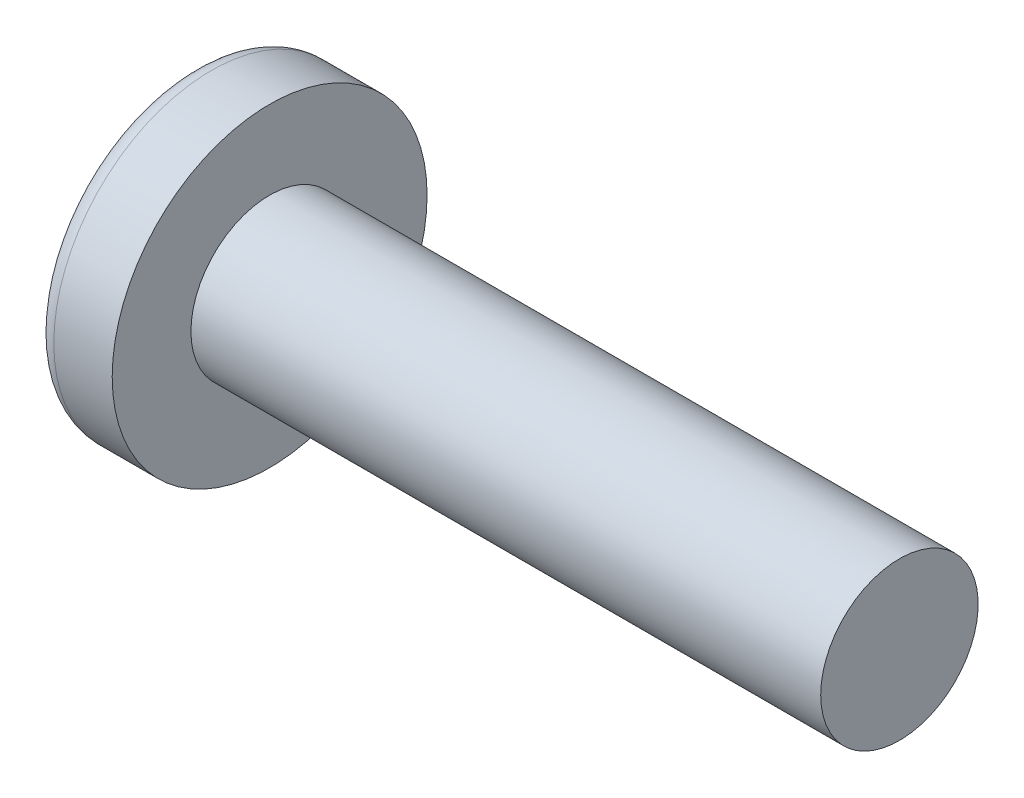
ISO-10303-21;
HEADER;
FILE_DESCRIPTION(('STEP AP214'),'2;1');
FILE_NAME('part.step','',(''),(''),'','','');
FILE_SCHEMA(('AUTOMOTIVE_DESIGN { 1 0 10303 214 1 1 1 1 }'));
ENDSEC;
DATA;
#1=APPLICATION_CONTEXT('core data for automotive mechanical design processes');
#2=APPLICATION_PROTOCOL_DEFINITION('international standard','automotive_design',2000,#1);
#3=PRODUCT_CONTEXT('',#1,'mechanical');
#4=PRODUCT('Part','Part','',(#3));
#5=PRODUCT_RELATED_PRODUCT_CATEGORY('part','',(#4));
#6=PRODUCT_DEFINITION_FORMATION('','',#4);
#7=PRODUCT_DEFINITION_CONTEXT('part definition',#1,'design');
#8=PRODUCT_DEFINITION('design','',#6,#7);
#9=PRODUCT_DEFINITION_SHAPE('','',#8);
#10=(LENGTH_UNIT() NAMED_UNIT(*) SI_UNIT(.MILLI.,.METRE.));
#11=(NAMED_UNIT(*) PLANE_ANGLE_UNIT() SI_UNIT($,.RADIAN.));
#12=(NAMED_UNIT(*) SI_UNIT($,.STERADIAN.) SOLID_ANGLE_UNIT());
#13=UNCERTAINTY_MEASURE_WITH_UNIT(LENGTH_MEASURE(1.E-05),#10,'distance_accuracy_value','');
#14=(GEOMETRIC_REPRESENTATION_CONTEXT(3) GLOBAL_UNCERTAINTY_ASSIGNED_CONTEXT((#13)) GLOBAL_UNIT_ASSIGNED_CONTEXT((#10,
#11,#12)) REPRESENTATION_CONTEXT('',''));
#15=CARTESIAN_POINT('',(0.,0.,0.));
#16=DIRECTION('',(0.,0.,1.));
#17=DIRECTION('',(1.,0.,0.));
#18=AXIS2_PLACEMENT_3D('',#15,#16,#17);
#19=CARTESIAN_POINT('',(6.5,0.,0.));
#20=DIRECTION('',(-1.,0.,0.));
#21=DIRECTION('',(0.,1.,0.));
#22=AXIS2_PLACEMENT_3D('',#19,#20,#21);
#23=SPHERICAL_SURFACE('',#22,6.5);
#24=CARTESIAN_POINT('',(1.22696010591455,0.,0.));
#25=DIRECTION('',(-1.,0.,0.));
#26=DIRECTION('',(0.,0.,1.));
#27=AXIS2_PLACEMENT_3D('',#24,#25,#26);
#28=CIRCLE('',#27,3.80066445182724);
#29=CARTESIAN_POINT('',(1.22696010591455,0.,3.80066445182724));
#30=VERTEX_POINT('',#29);
#31=EDGE_CURVE('E153',#30,#30,#28,.T.);
#32=ORIENTED_EDGE('',*,*,#31,.T.);
#33=EDGE_LOOP('',(#32));
#34=FACE_BOUND('',#33,.T.);
#35=CARTESIAN_POINT('',(6.48571960757402,-0.15048155459631,0.));
#36=DIRECTION('',(-0.0944735162161081,-0.995527375180494,0.));
#37=DIRECTION('',(0.995527375180494,-0.0944735162161081,0.));
#38=AXIS2_PLACEMENT_3D('',#35,#36,#37);
#39=CIRCLE('',#38,6.49824217555167);
#40=CARTESIAN_POINT('',(0.314004666074212,0.4352015980154,1.94783502836694));
#41=VERTEX_POINT('',#40);
#42=CARTESIAN_POINT('',(0.0329034112486444,0.461877533422321,0.461877533422322));
#43=VERTEX_POINT('',#42);
#44=EDGE_CURVE('E184',#41,#43,#39,.T.);
#45=ORIENTED_EDGE('',*,*,#44,.F.);
#46=CARTESIAN_POINT('',(5.02565375064329,0.,-1.83590765485334));
#47=DIRECTION('',(0.626149356629992,0.,0.779703137861998));
#48=DIRECTION('',(0.779703137861998,0.,-0.626149356629992));
#49=AXIS2_PLACEMENT_3D('',#46,#47,#48);
#50=CIRCLE('',#49,6.05852673674539);
#51=CARTESIAN_POINT('',(0.314004666074212,-0.435201598015413,1.94783502836693));
#52=VERTEX_POINT('',#51);
#53=EDGE_CURVE('E149',#41,#52,#50,.T.);
#54=ORIENTED_EDGE('',*,*,#53,.T.);
#55=CARTESIAN_POINT('',(6.48571960757402,0.15048155459631,0.));
#56=DIRECTION('',(-0.094473516216108,0.995527375180494,0.));
#57=DIRECTION('',(-0.995527375180494,-0.094473516216108,0.));
#58=AXIS2_PLACEMENT_3D('',#55,#56,#57);
#59=CIRCLE('',#58,6.49824217555167);
#60=CARTESIAN_POINT('',(0.0329034112486444,-0.461877533422324,0.461877533422322));
#61=VERTEX_POINT('',#60);
#62=EDGE_CURVE('E105',#61,#52,#59,.T.);
#63=ORIENTED_EDGE('',*,*,#62,.F.);
#64=CARTESIAN_POINT('',(6.48571960757402,0.,-0.15048155459631));
#65=DIRECTION('',(-0.094473516216108,0.,-0.995527375180494));
#66=DIRECTION('',(-0.995527375180494,0.,0.094473516216108));
#67=AXIS2_PLACEMENT_3D('',#64,#65,#66);
#68=CIRCLE('',#67,6.49824217555167);
#69=CARTESIAN_POINT('',(0.314004666074212,-1.94783502836693,0.435201598015406));
#70=VERTEX_POINT('',#69);
#71=EDGE_CURVE('E130',#70,#61,#68,.T.);
#72=ORIENTED_EDGE('',*,*,#71,.F.);
#73=CARTESIAN_POINT('',(5.02565375064329,1.83590765485334,0.));
#74=DIRECTION('',(0.626149356629992,-0.779703137861998,0.));
#75=DIRECTION('',(0.779703137861998,0.626149356629992,0.));
#76=AXIS2_PLACEMENT_3D('',#73,#74,#75);
#77=CIRCLE('',#76,6.05852673674539);
#78=CARTESIAN_POINT('',(0.314004666074212,-1.94783502836693,-0.435201598015406));
#79=VERTEX_POINT('',#78);
#80=EDGE_CURVE('E138',#70,#79,#77,.T.);
#81=ORIENTED_EDGE('',*,*,#80,.T.);
#82=CARTESIAN_POINT('',(6.48571960757402,0.,0.15048155459631));
#83=DIRECTION('',(-0.0944735162161081,0.,0.995527375180494));
#84=DIRECTION('',(0.995527375180494,0.,0.0944735162161081));
#85=AXIS2_PLACEMENT_3D('',#82,#83,#84);
#86=CIRCLE('',#85,6.49824217555167);
#87=CARTESIAN_POINT('',(0.0329034112486444,-0.461877533422321,-0.461877533422323));
#88=VERTEX_POINT('',#87);
#89=EDGE_CURVE('E48',#88,#79,#86,.T.);
#90=ORIENTED_EDGE('',*,*,#89,.F.);
#91=CARTESIAN_POINT('',(0.314004666074212,-0.435201598015399,-1.94783502836693));
#92=VERTEX_POINT('',#91);
#93=EDGE_CURVE('E191',#92,#88,#59,.T.);
#94=ORIENTED_EDGE('',*,*,#93,.F.);
#95=CARTESIAN_POINT('',(5.02565375064329,0.,1.83590765485334));
#96=DIRECTION('',(0.626149356629992,0.,-0.779703137861998));
#97=DIRECTION('',(-0.779703137861998,0.,-0.626149356629992));
#98=AXIS2_PLACEMENT_3D('',#95,#96,#97);
#99=CIRCLE('',#98,6.05852673674539);
#100=CARTESIAN_POINT('',(0.314004666074213,0.435201598015413,-1.94783502836693));
#101=VERTEX_POINT('',#100);
#102=EDGE_CURVE('E131',#92,#101,#99,.T.);
#103=ORIENTED_EDGE('',*,*,#102,.T.);
#104=CARTESIAN_POINT('',(0.0329034112486444,0.461877533422324,-0.461877533422323));
#105=VERTEX_POINT('',#104);
#106=EDGE_CURVE('E179',#105,#101,#39,.T.);
#107=ORIENTED_EDGE('',*,*,#106,.F.);
#108=CARTESIAN_POINT('',(0.314004666074214,1.94783502836693,-0.435201598015406));
#109=VERTEX_POINT('',#108);
#110=EDGE_CURVE('E41',#109,#105,#86,.T.);
#111=ORIENTED_EDGE('',*,*,#110,.F.);
#112=CARTESIAN_POINT('',(5.02565375064329,-1.83590765485334,0.));
#113=DIRECTION('',(0.626149356629992,0.779703137861998,0.));
#114=DIRECTION('',(-0.779703137861998,0.626149356629992,0.));
#115=AXIS2_PLACEMENT_3D('',#112,#113,#114);
#116=CIRCLE('',#115,6.05852673674539);
#117=CARTESIAN_POINT('',(0.314004666074214,1.94783502836693,0.435201598015406));
#118=VERTEX_POINT('',#117);
#119=EDGE_CURVE('E11',#109,#118,#116,.T.);
#120=ORIENTED_EDGE('',*,*,#119,.T.);
#121=EDGE_CURVE('E167',#43,#118,#68,.T.);
#122=ORIENTED_EDGE('',*,*,#121,.F.);
#123=EDGE_LOOP('',(#45,#54,#63,#72,#81,#90,#94,#103,#107,#111,#120,#122));
#124=FACE_BOUND('',#123,.T.);
#125=ADVANCED_FACE('F33',(#34,#124),#23,.T.);
#126=CARTESIAN_POINT('',(2.73951715374841,0.,-0.20502541296061));
#127=DIRECTION('',(-0.0944735162161081,0.,0.995527375180494));
#128=DIRECTION('',(0.995527375180494,0.,0.0944735162161081));
#129=AXIS2_PLACEMENT_3D('',#126,#127,#128);
#130=PLANE('',#129);
#131=ORIENTED_EDGE('',*,*,#110,.T.);
#132=DIRECTION('',(0.991114231601325,-0.0940547178968607,0.0940547178968604));
#133=VECTOR('',#132,1.);
#134=CARTESIAN_POINT('',(2.75862941145706,0.203211698708667,-0.203211698708667));
#135=LINE('',#134,#133);
#136=CARTESIAN_POINT('',(2.45,0.232500000000001,-0.232499999999999));
#137=VERTEX_POINT('',#136);
#138=EDGE_CURVE('E173',#105,#137,#135,.T.);
#139=ORIENTED_EDGE('',*,*,#138,.T.);
#140=DIRECTION('',(0.777577482844895,-0.624442325509115,0.0737905162291584));
#141=VECTOR('',#140,1.);
#142=CARTESIAN_POINT('',(0.,2.2,-0.465));
#143=LINE('',#142,#141);
#144=EDGE_CURVE('E154',#109,#137,#143,.T.);
#145=ORIENTED_EDGE('',*,*,#144,.F.);
#146=EDGE_LOOP('',(#131,#139,#145));
#147=FACE_BOUND('',#146,.T.);
#148=ADVANCED_FACE('F172',(#147),#130,.T.);
#149=DIRECTION('',(0.777577482844895,0.624442325509115,0.0737905162291584));
#150=VECTOR('',#149,1.);
#151=CARTESIAN_POINT('',(0.,-2.2,-0.465));
#152=LINE('',#151,#150);
#153=CARTESIAN_POINT('',(2.45,-0.2325,-0.2325));
#154=VERTEX_POINT('',#153);
#155=EDGE_CURVE('E139',#79,#154,#152,.T.);
#156=ORIENTED_EDGE('',*,*,#155,.T.);
#157=DIRECTION('',(-0.991114231601325,-0.0940547178968599,-0.0940547178968604));
#158=VECTOR('',#157,1.);
#159=CARTESIAN_POINT('',(2.75862941145706,-0.203211698708666,-0.203211698708667));
#160=LINE('',#159,#158);
#161=EDGE_CURVE('E194',#154,#88,#160,.T.);
#162=ORIENTED_EDGE('',*,*,#161,.T.);
#163=ORIENTED_EDGE('',*,*,#89,.T.);
#164=EDGE_LOOP('',(#156,#162,#163));
#165=FACE_BOUND('',#164,.T.);
#166=ADVANCED_FACE('F209',(#165),#130,.T.);
#167=CARTESIAN_POINT('',(2.73951715374841,0.,0.20502541296061));
#168=DIRECTION('',(-0.094473516216108,0.,-0.995527375180494));
#169=DIRECTION('',(-0.995527375180494,0.,0.094473516216108));
#170=AXIS2_PLACEMENT_3D('',#167,#168,#169);
#171=PLANE('',#170);
#172=DIRECTION('',(0.777577482844895,-0.624442325509115,-0.0737905162291584));
#173=VECTOR('',#172,1.);
#174=CARTESIAN_POINT('',(0.,2.2,0.465));
#175=LINE('',#174,#173);
#176=CARTESIAN_POINT('',(2.45,0.2325,0.2325));
#177=VERTEX_POINT('',#176);
#178=EDGE_CURVE('E210',#118,#177,#175,.T.);
#179=ORIENTED_EDGE('',*,*,#178,.T.);
#180=DIRECTION('',(-0.991114231601325,0.0940547178968601,0.0940547178968603));
#181=VECTOR('',#180,1.);
#182=CARTESIAN_POINT('',(2.75862941145706,0.203211698708666,0.203211698708667));
#183=LINE('',#182,#181);
#184=EDGE_CURVE('E188',#177,#43,#183,.T.);
#185=ORIENTED_EDGE('',*,*,#184,.T.);
#186=ORIENTED_EDGE('',*,*,#121,.T.);
#187=EDGE_LOOP('',(#179,#185,#186));
#188=FACE_BOUND('',#187,.T.);
#189=ADVANCED_FACE('F214',(#188),#171,.T.);
#190=ORIENTED_EDGE('',*,*,#71,.T.);
#191=DIRECTION('',(0.991114231601325,0.0940547178968606,-0.0940547178968602));
#192=VECTOR('',#191,1.);
#193=CARTESIAN_POINT('',(2.75862941145706,-0.203211698708668,0.203211698708667));
#194=LINE('',#193,#192);
#195=CARTESIAN_POINT('',(2.45,-0.232500000000001,0.232499999999999));
#196=VERTEX_POINT('',#195);
#197=EDGE_CURVE('E103',#61,#196,#194,.T.);
#198=ORIENTED_EDGE('',*,*,#197,.T.);
#199=DIRECTION('',(0.777577482844895,0.624442325509115,-0.0737905162291582));
#200=VECTOR('',#199,1.);
#201=CARTESIAN_POINT('',(0.,-2.2,0.464999999999999));
#202=LINE('',#201,#200);
#203=EDGE_CURVE('E128',#70,#196,#202,.T.);
#204=ORIENTED_EDGE('',*,*,#203,.F.);
#205=EDGE_LOOP('',(#190,#198,#204));
#206=FACE_BOUND('',#205,.T.);
#207=ADVANCED_FACE('F127',(#206),#171,.T.);
#208=CARTESIAN_POINT('',(-25.4,0.,0.));
#209=DIRECTION('',(-1.,0.,0.));
#210=DIRECTION('',(0.,0.,1.));
#211=AXIS2_PLACEMENT_3D('',#208,#209,#210);
#212=CYLINDRICAL_SURFACE('',#211,2.);
#213=CARTESIAN_POINT('',(19.1,0.,0.));
#214=DIRECTION('',(-1.,0.,0.));
#215=DIRECTION('',(0.,0.,1.));
#216=AXIS2_PLACEMENT_3D('',#213,#214,#215);
#217=CIRCLE('',#216,2.);
#218=CARTESIAN_POINT('',(19.1,0.,2.));
#219=VERTEX_POINT('',#218);
#220=EDGE_CURVE('E150',#219,#219,#217,.T.);
#221=ORIENTED_EDGE('',*,*,#220,.T.);
#222=EDGE_LOOP('',(#221));
#223=FACE_BOUND('',#222,.T.);
#224=CARTESIAN_POINT('',(3.1,0.,0.));
#225=DIRECTION('',(-1.,0.,0.));
#226=DIRECTION('',(0.,0.,1.));
#227=AXIS2_PLACEMENT_3D('',#224,#225,#226);
#228=CIRCLE('',#227,2.);
#229=CARTESIAN_POINT('',(3.1,0.,2.));
#230=VERTEX_POINT('',#229);
#231=EDGE_CURVE('E163',#230,#230,#228,.T.);
#232=ORIENTED_EDGE('',*,*,#231,.F.);
#233=EDGE_LOOP('',(#232));
#234=FACE_BOUND('',#233,.T.);
#235=ADVANCED_FACE('F35',(#223,#234),#212,.T.);
#236=CARTESIAN_POINT('',(3.1,2.,0.));
#237=DIRECTION('',(-1.,0.,0.));
#238=DIRECTION('',(0.,0.,1.));
#239=AXIS2_PLACEMENT_3D('',#236,#237,#238);
#240=PLANE('',#239);
#241=CARTESIAN_POINT('',(3.1,0.,0.));
#242=DIRECTION('',(-1.,0.,0.));
#243=DIRECTION('',(0.,0.,1.));
#244=AXIS2_PLACEMENT_3D('',#241,#242,#243);
#245=CIRCLE('',#244,4.);
#246=CARTESIAN_POINT('',(3.1,0.,4.));
#247=VERTEX_POINT('',#246);
#248=EDGE_CURVE('E160',#247,#247,#245,.T.);
#249=ORIENTED_EDGE('',*,*,#248,.F.);
#250=EDGE_LOOP('',(#249));
#251=FACE_BOUND('',#250,.T.);
#252=ORIENTED_EDGE('',*,*,#231,.T.);
#253=EDGE_LOOP('',(#252));
#254=FACE_BOUND('',#253,.T.);
#255=ADVANCED_FACE('F242',(#251,#254),#240,.F.);
#256=CARTESIAN_POINT('',(-25.4,0.,0.));
#257=DIRECTION('',(-1.,0.,0.));
#258=DIRECTION('',(0.,0.,1.));
#259=AXIS2_PLACEMENT_3D('',#256,#257,#258);
#260=CYLINDRICAL_SURFACE('',#259,4.);
#261=ORIENTED_EDGE('',*,*,#248,.T.);
#262=EDGE_LOOP('',(#261));
#263=FACE_BOUND('',#262,.T.);
#264=CARTESIAN_POINT('',(1.61635382117009,0.,0.));
#265=DIRECTION('',(-1.,0.,0.));
#266=DIRECTION('',(0.,0.,1.));
#267=AXIS2_PLACEMENT_3D('',#264,#265,#266);
#268=CIRCLE('',#267,4.);
#269=CARTESIAN_POINT('',(1.61635382117009,0.,4.));
#270=VERTEX_POINT('',#269);
#271=EDGE_CURVE('E157',#270,#270,#268,.T.);
#272=ORIENTED_EDGE('',*,*,#271,.F.);
#273=EDGE_LOOP('',(#272));
#274=FACE_BOUND('',#273,.T.);
#275=ADVANCED_FACE('F239',(#263,#274),#260,.T.);
#276=CARTESIAN_POINT('',(1.61635382117009,0.,0.));
#277=DIRECTION('',(-1.,0.,0.));
#278=DIRECTION('',(0.,0.,1.));
#279=AXIS2_PLACEMENT_3D('',#276,#277,#278);
#280=TOROIDAL_SURFACE('',#279,3.52,0.48);
#281=ORIENTED_EDGE('',*,*,#271,.T.);
#282=EDGE_LOOP('',(#281));
#283=FACE_BOUND('',#282,.T.);
#284=ORIENTED_EDGE('',*,*,#31,.F.);
#285=EDGE_LOOP('',(#284));
#286=FACE_BOUND('',#285,.T.);
#287=ADVANCED_FACE('F236',(#283,#286),#280,.T.);
#288=CARTESIAN_POINT('',(19.1,2.,0.));
#289=DIRECTION('',(1.,0.,0.));
#290=DIRECTION('',(0.,0.,-1.));
#291=AXIS2_PLACEMENT_3D('',#288,#289,#290);
#292=PLANE('',#291);
#293=ORIENTED_EDGE('',*,*,#220,.F.);
#294=EDGE_LOOP('',(#293));
#295=FACE_BOUND('',#294,.T.);
#296=ADVANCED_FACE('F234',(#295),#292,.T.);
#297=CARTESIAN_POINT('',(2.45,0.2325,0.2325));
#298=DIRECTION('',(0.626149356629992,0.779703137861998,0.));
#299=DIRECTION('',(-0.779703137861998,0.626149356629992,0.));
#300=AXIS2_PLACEMENT_3D('',#297,#298,#299);
#301=PLANE('',#300);
#302=ORIENTED_EDGE('',*,*,#144,.T.);
#303=DIRECTION('',(0.,0.,-1.));
#304=VECTOR('',#303,1.);
#305=CARTESIAN_POINT('',(2.45,0.2325,0.2325));
#306=LINE('',#305,#304);
#307=EDGE_CURVE('E121',#177,#137,#306,.T.);
#308=ORIENTED_EDGE('',*,*,#307,.F.);
#309=ORIENTED_EDGE('',*,*,#178,.F.);
#310=ORIENTED_EDGE('',*,*,#119,.F.);
#311=EDGE_LOOP('',(#302,#308,#309,#310));
#312=FACE_BOUND('',#311,.T.);
#313=ADVANCED_FACE('F213',(#312),#301,.F.);
#314=CARTESIAN_POINT('',(2.45,-0.2325,-0.2325));
#315=DIRECTION('',(0.626149356629992,-0.779703137861998,0.));
#316=DIRECTION('',(0.779703137861998,0.626149356629992,0.));
#317=AXIS2_PLACEMENT_3D('',#314,#315,#316);
#318=PLANE('',#317);
#319=ORIENTED_EDGE('',*,*,#203,.T.);
#320=DIRECTION('',(0.,0.,1.));
#321=VECTOR('',#320,1.);
#322=CARTESIAN_POINT('',(2.45,-0.2325,-0.2325));
#323=LINE('',#322,#321);
#324=EDGE_CURVE('E120',#154,#196,#323,.T.);
#325=ORIENTED_EDGE('',*,*,#324,.F.);
#326=ORIENTED_EDGE('',*,*,#155,.F.);
#327=ORIENTED_EDGE('',*,*,#80,.F.);
#328=EDGE_LOOP('',(#319,#325,#326,#327));
#329=FACE_BOUND('',#328,.T.);
#330=ADVANCED_FACE('F135',(#329),#318,.F.);
#331=CARTESIAN_POINT('',(2.45,0.2325,-0.2325));
#332=DIRECTION('',(-1.,0.,0.));
#333=DIRECTION('',(0.,0.,1.));
#334=AXIS2_PLACEMENT_3D('',#331,#332,#333);
#335=PLANE('',#334);
#336=DIRECTION('',(0.,1.,0.));
#337=VECTOR('',#336,1.);
#338=CARTESIAN_POINT('',(2.45,-0.2325,-0.2325));
#339=LINE('',#338,#337);
#340=EDGE_CURVE('E143',#154,#137,#339,.T.);
#341=ORIENTED_EDGE('',*,*,#340,.F.);
#342=ORIENTED_EDGE('',*,*,#324,.T.);
#343=DIRECTION('',(0.,-1.,0.));
#344=VECTOR('',#343,1.);
#345=CARTESIAN_POINT('',(2.45,0.2325,0.2325));
#346=LINE('',#345,#344);
#347=EDGE_CURVE('E112',#177,#196,#346,.T.);
#348=ORIENTED_EDGE('',*,*,#347,.F.);
#349=ORIENTED_EDGE('',*,*,#307,.T.);
#350=EDGE_LOOP('',(#341,#342,#348,#349));
#351=FACE_BOUND('',#350,.T.);
#352=ADVANCED_FACE('F141',(#351),#335,.T.);
#353=CARTESIAN_POINT('',(2.45,0.232500000000001,-0.232499999999999));
#354=DIRECTION('',(0.626149356629992,0.,-0.779703137861998));
#355=DIRECTION('',(0.779703137861998,0.,0.626149356629992));
#356=AXIS2_PLACEMENT_3D('',#353,#354,#355);
#357=PLANE('',#356);
#358=DIRECTION('',(0.777577482844895,0.0737905162291561,0.624442325509115));
#359=VECTOR('',#358,1.);
#360=CARTESIAN_POINT('',(0.,-0.464999999999992,-2.2));
#361=LINE('',#360,#359);
#362=EDGE_CURVE('E199',#92,#154,#361,.T.);
#363=ORIENTED_EDGE('',*,*,#362,.T.);
#364=ORIENTED_EDGE('',*,*,#340,.T.);
#365=DIRECTION('',(0.777577482844895,-0.0737905162291606,0.624442325509114));
#366=VECTOR('',#365,1.);
#367=CARTESIAN_POINT('',(0.,0.465000000000008,-2.2));
#368=LINE('',#367,#366);
#369=EDGE_CURVE('E109',#101,#137,#368,.T.);
#370=ORIENTED_EDGE('',*,*,#369,.F.);
#371=ORIENTED_EDGE('',*,*,#102,.F.);
#372=EDGE_LOOP('',(#363,#364,#370,#371));
#373=FACE_BOUND('',#372,.T.);
#374=ADVANCED_FACE('F204',(#373),#357,.F.);
#375=CARTESIAN_POINT('',(2.73951715374841,-0.20502541296061,0.));
#376=DIRECTION('',(-0.094473516216108,0.995527375180494,0.));
#377=DIRECTION('',(-0.995527375180494,-0.094473516216108,0.));
#378=AXIS2_PLACEMENT_3D('',#375,#376,#377);
#379=PLANE('',#378);
#380=ORIENTED_EDGE('',*,*,#93,.T.);
#381=ORIENTED_EDGE('',*,*,#161,.F.);
#382=ORIENTED_EDGE('',*,*,#362,.F.);
#383=EDGE_LOOP('',(#380,#381,#382));
#384=FACE_BOUND('',#383,.T.);
#385=ADVANCED_FACE('F208',(#384),#379,.T.);
#386=CARTESIAN_POINT('',(2.73951715374841,0.20502541296061,0.));
#387=DIRECTION('',(-0.0944735162161081,-0.995527375180494,0.));
#388=DIRECTION('',(0.995527375180494,-0.0944735162161081,0.));
#389=AXIS2_PLACEMENT_3D('',#386,#387,#388);
#390=PLANE('',#389);
#391=ORIENTED_EDGE('',*,*,#106,.T.);
#392=ORIENTED_EDGE('',*,*,#369,.T.);
#393=ORIENTED_EDGE('',*,*,#138,.F.);
#394=EDGE_LOOP('',(#391,#392,#393));
#395=FACE_BOUND('',#394,.T.);
#396=ADVANCED_FACE('F202',(#395),#390,.T.);
#397=CARTESIAN_POINT('',(2.45,-0.232500000000001,0.232499999999999));
#398=DIRECTION('',(0.626149356629992,0.,0.779703137861998));
#399=DIRECTION('',(-0.779703137861998,0.,0.626149356629992));
#400=AXIS2_PLACEMENT_3D('',#397,#398,#399);
#401=PLANE('',#400);
#402=DIRECTION('',(0.777577482844895,-0.0737905162291562,-0.624442325509115));
#403=VECTOR('',#402,1.);
#404=CARTESIAN_POINT('',(0.,0.464999999999992,2.2));
#405=LINE('',#404,#403);
#406=EDGE_CURVE('E108',#41,#177,#405,.T.);
#407=ORIENTED_EDGE('',*,*,#406,.T.);
#408=ORIENTED_EDGE('',*,*,#347,.T.);
#409=DIRECTION('',(0.777577482844895,0.0737905162291606,-0.624442325509114));
#410=VECTOR('',#409,1.);
#411=CARTESIAN_POINT('',(0.,-0.465000000000008,2.2));
#412=LINE('',#411,#410);
#413=EDGE_CURVE('E99',#52,#196,#412,.T.);
#414=ORIENTED_EDGE('',*,*,#413,.F.);
#415=ORIENTED_EDGE('',*,*,#53,.F.);
#416=EDGE_LOOP('',(#407,#408,#414,#415));
#417=FACE_BOUND('',#416,.T.);
#418=ADVANCED_FACE('F113',(#417),#401,.F.);
#419=ORIENTED_EDGE('',*,*,#44,.T.);
#420=ORIENTED_EDGE('',*,*,#184,.F.);
#421=ORIENTED_EDGE('',*,*,#406,.F.);
#422=EDGE_LOOP('',(#419,#420,#421));
#423=FACE_BOUND('',#422,.T.);
#424=ADVANCED_FACE('F215',(#423),#390,.T.);
#425=ORIENTED_EDGE('',*,*,#62,.T.);
#426=ORIENTED_EDGE('',*,*,#413,.T.);
#427=ORIENTED_EDGE('',*,*,#197,.F.);
#428=EDGE_LOOP('',(#425,#426,#427));
#429=FACE_BOUND('',#428,.T.);
#430=ADVANCED_FACE('F101',(#429),#379,.T.);
#431=CLOSED_SHELL('',(#125,#148,#166,#189,#207,#235,#255,#275,#287,#296,#313,#330,#352,#374,
#385,#396,#418,#424,#430));
#432=MANIFOLD_SOLID_BREP('B2',#431);
#433=ADVANCED_BREP_SHAPE_REPRESENTATION('',(#18,#432),#14);
#434=SHAPE_DEFINITION_REPRESENTATION(#9,#433);
ENDSEC;
END-ISO-10303-21;
